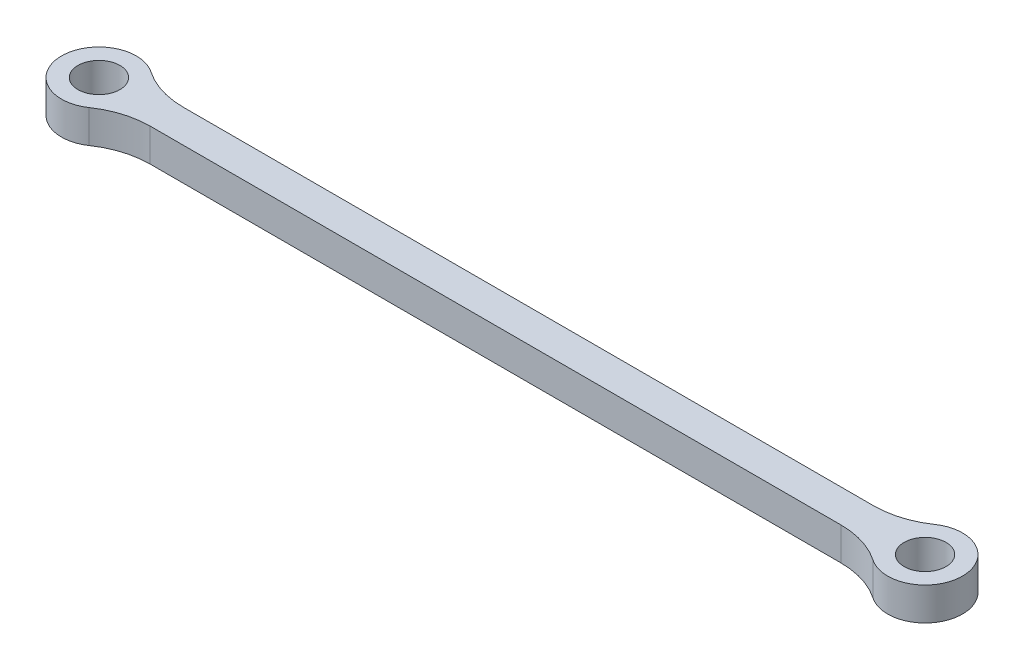
ISO-10303-21;
HEADER;
FILE_DESCRIPTION(('STEP AP214'),'2;1');
FILE_NAME('part.step','',(''),(''),'','','');
FILE_SCHEMA(('AUTOMOTIVE_DESIGN { 1 0 10303 214 1 1 1 1 }'));
ENDSEC;
DATA;
#1=APPLICATION_CONTEXT('core data for automotive mechanical design processes');
#2=APPLICATION_PROTOCOL_DEFINITION('international standard','automotive_design',2000,#1);
#3=PRODUCT_CONTEXT('',#1,'mechanical');
#4=PRODUCT('Part','Part','',(#3));
#5=PRODUCT_RELATED_PRODUCT_CATEGORY('part','',(#4));
#6=PRODUCT_DEFINITION_FORMATION('','',#4);
#7=PRODUCT_DEFINITION_CONTEXT('part definition',#1,'design');
#8=PRODUCT_DEFINITION('design','',#6,#7);
#9=PRODUCT_DEFINITION_SHAPE('','',#8);
#10=(LENGTH_UNIT() NAMED_UNIT(*) SI_UNIT(.MILLI.,.METRE.));
#11=(NAMED_UNIT(*) PLANE_ANGLE_UNIT() SI_UNIT($,.RADIAN.));
#12=(NAMED_UNIT(*) SI_UNIT($,.STERADIAN.) SOLID_ANGLE_UNIT());
#13=UNCERTAINTY_MEASURE_WITH_UNIT(LENGTH_MEASURE(1.E-05),#10,'distance_accuracy_value','');
#14=(GEOMETRIC_REPRESENTATION_CONTEXT(3) GLOBAL_UNCERTAINTY_ASSIGNED_CONTEXT((#13)) GLOBAL_UNIT_ASSIGNED_CONTEXT((#10,
#11,#12)) REPRESENTATION_CONTEXT('',''));
#15=CARTESIAN_POINT('',(0.,0.,0.));
#16=DIRECTION('',(0.,0.,1.));
#17=DIRECTION('',(1.,0.,0.));
#18=AXIS2_PLACEMENT_3D('',#15,#16,#17);
#19=CARTESIAN_POINT('',(0.,4.,0.));
#20=DIRECTION('',(0.,-1.,0.));
#21=DIRECTION('',(0.,0.,-1.));
#22=AXIS2_PLACEMENT_3D('',#19,#20,#21);
#23=CYLINDRICAL_SURFACE('',#22,4.55);
#24=CARTESIAN_POINT('',(0.,0.,0.));
#25=DIRECTION('',(0.,1.,0.));
#26=DIRECTION('',(0.,0.,1.));
#27=AXIS2_PLACEMENT_3D('',#24,#25,#26);
#28=CIRCLE('',#27,4.55);
#29=CARTESIAN_POINT('',(-2.57306499344974,0.,3.75257731958763));
#30=VERTEX_POINT('',#29);
#31=CARTESIAN_POINT('',(-2.57306499344974,0.,-3.75257731958763));
#32=VERTEX_POINT('',#31);
#33=EDGE_CURVE('E135',#30,#32,#28,.T.);
#34=ORIENTED_EDGE('',*,*,#33,.T.);
#35=DIRECTION('',(0.,-1.,0.));
#36=VECTOR('',#35,1.);
#37=CARTESIAN_POINT('',(-2.57306499344974,4.,-3.75257731958763));
#38=LINE('',#37,#36);
#39=CARTESIAN_POINT('',(-2.57306499344974,4.,-3.75257731958763));
#40=VERTEX_POINT('',#39);
#41=EDGE_CURVE('E153',#32,#40,#38,.F.);
#42=ORIENTED_EDGE('',*,*,#41,.T.);
#43=CARTESIAN_POINT('',(0.,4.,0.));
#44=DIRECTION('',(0.,1.,0.));
#45=DIRECTION('',(0.,0.,1.));
#46=AXIS2_PLACEMENT_3D('',#43,#44,#45);
#47=CIRCLE('',#46,4.55);
#48=CARTESIAN_POINT('',(-2.57306499344974,4.,3.75257731958763));
#49=VERTEX_POINT('',#48);
#50=EDGE_CURVE('E144',#49,#40,#47,.T.);
#51=ORIENTED_EDGE('',*,*,#50,.F.);
#52=DIRECTION('',(0.,-1.,0.));
#53=VECTOR('',#52,1.);
#54=CARTESIAN_POINT('',(-2.57306499344974,4.,3.75257731958763));
#55=LINE('',#54,#53);
#56=EDGE_CURVE('E150',#49,#30,#55,.T.);
#57=ORIENTED_EDGE('',*,*,#56,.T.);
#58=EDGE_LOOP('',(#34,#42,#51,#57));
#59=FACE_BOUND('',#58,.T.);
#60=ADVANCED_FACE('F39',(#59),#23,.T.);
#61=CARTESIAN_POINT('',(0.,4.,-2.));
#62=DIRECTION('',(0.,0.,1.));
#63=DIRECTION('',(1.,0.,0.));
#64=AXIS2_PLACEMENT_3D('',#61,#62,#63);
#65=PLANE('',#64);
#66=DIRECTION('',(-1.,0.,0.));
#67=VECTOR('',#66,1.);
#68=CARTESIAN_POINT('',(0.,0.,-2.));
#69=LINE('',#68,#67);
#70=CARTESIAN_POINT('',(-8.22815289114149,0.,-2.));
#71=VERTEX_POINT('',#70);
#72=CARTESIAN_POINT('',(-92.1718471088585,0.,-2.));
#73=VERTEX_POINT('',#72);
#74=EDGE_CURVE('E131',#71,#73,#69,.T.);
#75=ORIENTED_EDGE('',*,*,#74,.T.);
#76=DIRECTION('',(0.,1.,0.));
#77=VECTOR('',#76,1.);
#78=CARTESIAN_POINT('',(-92.1718471088585,4.,-2.));
#79=LINE('',#78,#77);
#80=CARTESIAN_POINT('',(-92.1718471088585,4.,-2.));
#81=VERTEX_POINT('',#80);
#82=EDGE_CURVE('E109',#73,#81,#79,.T.);
#83=ORIENTED_EDGE('',*,*,#82,.T.);
#84=DIRECTION('',(-1.,0.,0.));
#85=VECTOR('',#84,1.);
#86=CARTESIAN_POINT('',(0.,4.,-2.));
#87=LINE('',#86,#85);
#88=CARTESIAN_POINT('',(-8.22815289114149,4.,-2.));
#89=VERTEX_POINT('',#88);
#90=EDGE_CURVE('E179',#89,#81,#87,.T.);
#91=ORIENTED_EDGE('',*,*,#90,.F.);
#92=DIRECTION('',(0.,1.,0.));
#93=VECTOR('',#92,1.);
#94=CARTESIAN_POINT('',(-8.22815289114149,0.,-2.));
#95=LINE('',#94,#93);
#96=EDGE_CURVE('E123',#89,#71,#95,.F.);
#97=ORIENTED_EDGE('',*,*,#96,.T.);
#98=EDGE_LOOP('',(#75,#83,#91,#97));
#99=FACE_BOUND('',#98,.T.);
#100=ADVANCED_FACE('F199',(#99),#65,.F.);
#101=CARTESIAN_POINT('',(-100.4,4.,0.));
#102=DIRECTION('',(0.,-1.,0.));
#103=DIRECTION('',(0.,0.,-1.));
#104=AXIS2_PLACEMENT_3D('',#101,#102,#103);
#105=CYLINDRICAL_SURFACE('',#104,4.55);
#106=CARTESIAN_POINT('',(-100.4,4.,0.));
#107=DIRECTION('',(0.,1.,0.));
#108=DIRECTION('',(0.,0.,1.));
#109=AXIS2_PLACEMENT_3D('',#106,#107,#108);
#110=CIRCLE('',#109,4.55);
#111=CARTESIAN_POINT('',(-97.8269350065503,4.,-3.75257731958762));
#112=VERTEX_POINT('',#111);
#113=CARTESIAN_POINT('',(-97.8269350065502,4.,3.75257731958763));
#114=VERTEX_POINT('',#113);
#115=EDGE_CURVE('E122',#112,#114,#110,.T.);
#116=ORIENTED_EDGE('',*,*,#115,.F.);
#117=DIRECTION('',(0.,-1.,0.));
#118=VECTOR('',#117,1.);
#119=CARTESIAN_POINT('',(-97.8269350065503,4.,-3.75257731958762));
#120=LINE('',#119,#118);
#121=CARTESIAN_POINT('',(-97.8269350065503,0.,-3.75257731958762));
#122=VERTEX_POINT('',#121);
#123=EDGE_CURVE('E108',#112,#122,#120,.T.);
#124=ORIENTED_EDGE('',*,*,#123,.T.);
#125=CARTESIAN_POINT('',(-100.4,0.,0.));
#126=DIRECTION('',(0.,1.,0.));
#127=DIRECTION('',(0.,0.,1.));
#128=AXIS2_PLACEMENT_3D('',#125,#126,#127);
#129=CIRCLE('',#128,4.55);
#130=CARTESIAN_POINT('',(-97.8269350065502,0.,3.75257731958763));
#131=VERTEX_POINT('',#130);
#132=EDGE_CURVE('E120',#122,#131,#129,.T.);
#133=ORIENTED_EDGE('',*,*,#132,.T.);
#134=DIRECTION('',(0.,-1.,0.));
#135=VECTOR('',#134,1.);
#136=CARTESIAN_POINT('',(-97.8269350065502,4.,3.75257731958763));
#137=LINE('',#136,#135);
#138=EDGE_CURVE('E124',#131,#114,#137,.F.);
#139=ORIENTED_EDGE('',*,*,#138,.T.);
#140=EDGE_LOOP('',(#116,#124,#133,#139));
#141=FACE_BOUND('',#140,.T.);
#142=ADVANCED_FACE('F119',(#141),#105,.T.);
#143=CARTESIAN_POINT('',(-100.4,4.,0.));
#144=DIRECTION('',(0.,-1.,0.));
#145=DIRECTION('',(0.,0.,-1.));
#146=AXIS2_PLACEMENT_3D('',#143,#144,#145);
#147=CYLINDRICAL_SURFACE('',#146,2.54999999999999);
#148=CARTESIAN_POINT('',(-100.4,4.,0.));
#149=DIRECTION('',(0.,1.,0.));
#150=DIRECTION('',(0.,0.,1.));
#151=AXIS2_PLACEMENT_3D('',#148,#149,#150);
#152=CIRCLE('',#151,2.54999999999999);
#153=CARTESIAN_POINT('',(-100.4,4.,2.55));
#154=VERTEX_POINT('',#153);
#155=EDGE_CURVE('E187',#154,#154,#152,.T.);
#156=ORIENTED_EDGE('',*,*,#155,.T.);
#157=EDGE_LOOP('',(#156));
#158=FACE_BOUND('',#157,.T.);
#159=CARTESIAN_POINT('',(-100.4,0.,0.));
#160=DIRECTION('',(0.,1.,0.));
#161=DIRECTION('',(0.,0.,1.));
#162=AXIS2_PLACEMENT_3D('',#159,#160,#161);
#163=CIRCLE('',#162,2.54999999999999);
#164=CARTESIAN_POINT('',(-100.4,0.,2.55));
#165=VERTEX_POINT('',#164);
#166=EDGE_CURVE('E133',#165,#165,#163,.T.);
#167=ORIENTED_EDGE('',*,*,#166,.F.);
#168=EDGE_LOOP('',(#167));
#169=FACE_BOUND('',#168,.T.);
#170=ADVANCED_FACE('F206',(#158,#169),#147,.F.);
#171=CARTESIAN_POINT('',(0.,4.,2.));
#172=DIRECTION('',(0.,0.,1.));
#173=DIRECTION('',(1.,0.,0.));
#174=AXIS2_PLACEMENT_3D('',#171,#172,#173);
#175=PLANE('',#174);
#176=DIRECTION('',(-1.,0.,0.));
#177=VECTOR('',#176,1.);
#178=CARTESIAN_POINT('',(0.,0.,2.));
#179=LINE('',#178,#177);
#180=CARTESIAN_POINT('',(-8.22815289114149,0.,2.));
#181=VERTEX_POINT('',#180);
#182=CARTESIAN_POINT('',(-92.1718471088585,0.,2.));
#183=VERTEX_POINT('',#182);
#184=EDGE_CURVE('E130',#181,#183,#179,.T.);
#185=ORIENTED_EDGE('',*,*,#184,.F.);
#186=DIRECTION('',(0.,-1.,0.));
#187=VECTOR('',#186,1.);
#188=CARTESIAN_POINT('',(-8.22815289114149,4.,2.));
#189=LINE('',#188,#187);
#190=CARTESIAN_POINT('',(-8.22815289114149,4.,2.));
#191=VERTEX_POINT('',#190);
#192=EDGE_CURVE('E59',#181,#191,#189,.F.);
#193=ORIENTED_EDGE('',*,*,#192,.T.);
#194=DIRECTION('',(-1.,0.,0.));
#195=VECTOR('',#194,1.);
#196=CARTESIAN_POINT('',(0.,4.,2.));
#197=LINE('',#196,#195);
#198=CARTESIAN_POINT('',(-92.1718471088585,4.,2.));
#199=VERTEX_POINT('',#198);
#200=EDGE_CURVE('E173',#191,#199,#197,.T.);
#201=ORIENTED_EDGE('',*,*,#200,.T.);
#202=DIRECTION('',(0.,-1.,0.));
#203=VECTOR('',#202,1.);
#204=CARTESIAN_POINT('',(-92.1718471088585,4.,2.));
#205=LINE('',#204,#203);
#206=EDGE_CURVE('E155',#199,#183,#205,.T.);
#207=ORIENTED_EDGE('',*,*,#206,.T.);
#208=EDGE_LOOP('',(#185,#193,#201,#207));
#209=FACE_BOUND('',#208,.T.);
#210=ADVANCED_FACE('F182',(#209),#175,.T.);
#211=CARTESIAN_POINT('',(0.,4.,0.));
#212=DIRECTION('',(0.,-1.,0.));
#213=DIRECTION('',(0.,0.,-1.));
#214=AXIS2_PLACEMENT_3D('',#211,#212,#213);
#215=CYLINDRICAL_SURFACE('',#214,2.55);
#216=CARTESIAN_POINT('',(0.,4.,0.));
#217=DIRECTION('',(0.,1.,0.));
#218=DIRECTION('',(0.,0.,1.));
#219=AXIS2_PLACEMENT_3D('',#216,#217,#218);
#220=CIRCLE('',#219,2.55);
#221=CARTESIAN_POINT('',(0.,4.,2.55));
#222=VERTEX_POINT('',#221);
#223=EDGE_CURVE('E145',#222,#222,#220,.T.);
#224=ORIENTED_EDGE('',*,*,#223,.T.);
#225=EDGE_LOOP('',(#224));
#226=FACE_BOUND('',#225,.T.);
#227=CARTESIAN_POINT('',(0.,0.,0.));
#228=DIRECTION('',(0.,1.,0.));
#229=DIRECTION('',(0.,0.,1.));
#230=AXIS2_PLACEMENT_3D('',#227,#228,#229);
#231=CIRCLE('',#230,2.55);
#232=CARTESIAN_POINT('',(0.,0.,2.55));
#233=VERTEX_POINT('',#232);
#234=EDGE_CURVE('E141',#233,#233,#231,.T.);
#235=ORIENTED_EDGE('',*,*,#234,.F.);
#236=EDGE_LOOP('',(#235));
#237=FACE_BOUND('',#236,.T.);
#238=ADVANCED_FACE('F254',(#226,#237),#215,.F.);
#239=CARTESIAN_POINT('',(0.,4.,0.));
#240=DIRECTION('',(0.,1.,0.));
#241=DIRECTION('',(0.,0.,1.));
#242=AXIS2_PLACEMENT_3D('',#239,#240,#241);
#243=PLANE('',#242);
#244=ORIENTED_EDGE('',*,*,#200,.F.);
#245=CARTESIAN_POINT('',(-8.22815289114149,4.,12.));
#246=DIRECTION('',(0.,1.,0.));
#247=DIRECTION('',(0.,0.,1.));
#248=AXIS2_PLACEMENT_3D('',#245,#246,#247);
#249=CIRCLE('',#248,10.);
#250=EDGE_CURVE('E166',#191,#49,#249,.F.);
#251=ORIENTED_EDGE('',*,*,#250,.T.);
#252=ORIENTED_EDGE('',*,*,#50,.T.);
#253=CARTESIAN_POINT('',(-8.22815289114149,4.,-12.));
#254=DIRECTION('',(0.,1.,0.));
#255=DIRECTION('',(0.,0.,1.));
#256=AXIS2_PLACEMENT_3D('',#253,#254,#255);
#257=CIRCLE('',#256,10.);
#258=EDGE_CURVE('E162',#40,#89,#257,.F.);
#259=ORIENTED_EDGE('',*,*,#258,.T.);
#260=ORIENTED_EDGE('',*,*,#90,.T.);
#261=CARTESIAN_POINT('',(-92.1718471088585,4.,-12.));
#262=DIRECTION('',(0.,1.,0.));
#263=DIRECTION('',(0.,0.,1.));
#264=AXIS2_PLACEMENT_3D('',#261,#262,#263);
#265=CIRCLE('',#264,10.);
#266=EDGE_CURVE('E114',#81,#112,#265,.F.);
#267=ORIENTED_EDGE('',*,*,#266,.T.);
#268=ORIENTED_EDGE('',*,*,#115,.T.);
#269=CARTESIAN_POINT('',(-92.1718471088585,4.,12.));
#270=DIRECTION('',(0.,1.,0.));
#271=DIRECTION('',(0.,0.,1.));
#272=AXIS2_PLACEMENT_3D('',#269,#270,#271);
#273=CIRCLE('',#272,10.);
#274=EDGE_CURVE('E11',#114,#199,#273,.F.);
#275=ORIENTED_EDGE('',*,*,#274,.T.);
#276=EDGE_LOOP('',(#244,#251,#252,#259,#260,#267,#268,#275));
#277=FACE_BOUND('',#276,.T.);
#278=ORIENTED_EDGE('',*,*,#155,.F.);
#279=EDGE_LOOP('',(#278));
#280=FACE_BOUND('',#279,.T.);
#281=ORIENTED_EDGE('',*,*,#223,.F.);
#282=EDGE_LOOP('',(#281));
#283=FACE_BOUND('',#282,.T.);
#284=ADVANCED_FACE('F170',(#277,#280,#283),#243,.T.);
#285=CARTESIAN_POINT('',(0.,0.,0.));
#286=DIRECTION('',(0.,1.,0.));
#287=DIRECTION('',(0.,0.,1.));
#288=AXIS2_PLACEMENT_3D('',#285,#286,#287);
#289=PLANE('',#288);
#290=ORIENTED_EDGE('',*,*,#33,.F.);
#291=CARTESIAN_POINT('',(-8.22815289114149,0.,12.));
#292=DIRECTION('',(0.,1.,0.));
#293=DIRECTION('',(0.,0.,1.));
#294=AXIS2_PLACEMENT_3D('',#291,#292,#293);
#295=CIRCLE('',#294,10.);
#296=EDGE_CURVE('E164',#30,#181,#295,.T.);
#297=ORIENTED_EDGE('',*,*,#296,.T.);
#298=ORIENTED_EDGE('',*,*,#184,.T.);
#299=CARTESIAN_POINT('',(-92.1718471088585,0.,12.));
#300=DIRECTION('',(0.,1.,0.));
#301=DIRECTION('',(0.,0.,1.));
#302=AXIS2_PLACEMENT_3D('',#299,#300,#301);
#303=CIRCLE('',#302,10.);
#304=EDGE_CURVE('E47',#183,#131,#303,.T.);
#305=ORIENTED_EDGE('',*,*,#304,.T.);
#306=ORIENTED_EDGE('',*,*,#132,.F.);
#307=CARTESIAN_POINT('',(-92.1718471088585,0.,-12.));
#308=DIRECTION('',(0.,1.,0.));
#309=DIRECTION('',(0.,0.,1.));
#310=AXIS2_PLACEMENT_3D('',#307,#308,#309);
#311=CIRCLE('',#310,10.);
#312=EDGE_CURVE('E104',#122,#73,#311,.T.);
#313=ORIENTED_EDGE('',*,*,#312,.T.);
#314=ORIENTED_EDGE('',*,*,#74,.F.);
#315=CARTESIAN_POINT('',(-8.22815289114149,0.,-12.));
#316=DIRECTION('',(0.,1.,0.));
#317=DIRECTION('',(0.,0.,1.));
#318=AXIS2_PLACEMENT_3D('',#315,#316,#317);
#319=CIRCLE('',#318,10.);
#320=EDGE_CURVE('E160',#71,#32,#319,.T.);
#321=ORIENTED_EDGE('',*,*,#320,.T.);
#322=EDGE_LOOP('',(#290,#297,#298,#305,#306,#313,#314,#321));
#323=FACE_BOUND('',#322,.T.);
#324=ORIENTED_EDGE('',*,*,#166,.T.);
#325=EDGE_LOOP('',(#324));
#326=FACE_BOUND('',#325,.T.);
#327=ORIENTED_EDGE('',*,*,#234,.T.);
#328=EDGE_LOOP('',(#327));
#329=FACE_BOUND('',#328,.T.);
#330=ADVANCED_FACE('F127',(#323,#326,#329),#289,.F.);
#331=CARTESIAN_POINT('',(-92.1718471088585,4.,-12.));
#332=DIRECTION('',(0.,-1.,0.));
#333=DIRECTION('',(0.,0.,-1.));
#334=AXIS2_PLACEMENT_3D('',#331,#332,#333);
#335=CYLINDRICAL_SURFACE('',#334,10.);
#336=ORIENTED_EDGE('',*,*,#266,.F.);
#337=ORIENTED_EDGE('',*,*,#82,.F.);
#338=ORIENTED_EDGE('',*,*,#312,.F.);
#339=ORIENTED_EDGE('',*,*,#123,.F.);
#340=EDGE_LOOP('',(#336,#337,#338,#339));
#341=FACE_BOUND('',#340,.T.);
#342=ADVANCED_FACE('F107',(#341),#335,.F.);
#343=CARTESIAN_POINT('',(-8.22815289114149,4.,-12.));
#344=DIRECTION('',(0.,-1.,0.));
#345=DIRECTION('',(0.,0.,-1.));
#346=AXIS2_PLACEMENT_3D('',#343,#344,#345);
#347=CYLINDRICAL_SURFACE('',#346,10.);
#348=ORIENTED_EDGE('',*,*,#258,.F.);
#349=ORIENTED_EDGE('',*,*,#41,.F.);
#350=ORIENTED_EDGE('',*,*,#320,.F.);
#351=ORIENTED_EDGE('',*,*,#96,.F.);
#352=EDGE_LOOP('',(#348,#349,#350,#351));
#353=FACE_BOUND('',#352,.T.);
#354=ADVANCED_FACE('F195',(#353),#347,.F.);
#355=CARTESIAN_POINT('',(-8.22815289114149,4.,12.));
#356=DIRECTION('',(0.,-1.,0.));
#357=DIRECTION('',(0.,0.,-1.));
#358=AXIS2_PLACEMENT_3D('',#355,#356,#357);
#359=CYLINDRICAL_SURFACE('',#358,10.);
#360=ORIENTED_EDGE('',*,*,#250,.F.);
#361=ORIENTED_EDGE('',*,*,#192,.F.);
#362=ORIENTED_EDGE('',*,*,#296,.F.);
#363=ORIENTED_EDGE('',*,*,#56,.F.);
#364=EDGE_LOOP('',(#360,#361,#362,#363));
#365=FACE_BOUND('',#364,.T.);
#366=ADVANCED_FACE('F181',(#365),#359,.F.);
#367=CARTESIAN_POINT('',(-92.1718471088585,4.,12.));
#368=DIRECTION('',(0.,-1.,0.));
#369=DIRECTION('',(0.,0.,-1.));
#370=AXIS2_PLACEMENT_3D('',#367,#368,#369);
#371=CYLINDRICAL_SURFACE('',#370,10.);
#372=ORIENTED_EDGE('',*,*,#274,.F.);
#373=ORIENTED_EDGE('',*,*,#138,.F.);
#374=ORIENTED_EDGE('',*,*,#304,.F.);
#375=ORIENTED_EDGE('',*,*,#206,.F.);
#376=EDGE_LOOP('',(#372,#373,#374,#375));
#377=FACE_BOUND('',#376,.T.);
#378=ADVANCED_FACE('F41',(#377),#371,.F.);
#379=CLOSED_SHELL('',(#60,#100,#142,#170,#210,#238,#284,#330,#342,#354,#366,#378));
#380=MANIFOLD_SOLID_BREP('B2',#379);
#381=ADVANCED_BREP_SHAPE_REPRESENTATION('',(#18,#380),#14);
#382=SHAPE_DEFINITION_REPRESENTATION(#9,#381);
ENDSEC;
END-ISO-10303-21;
